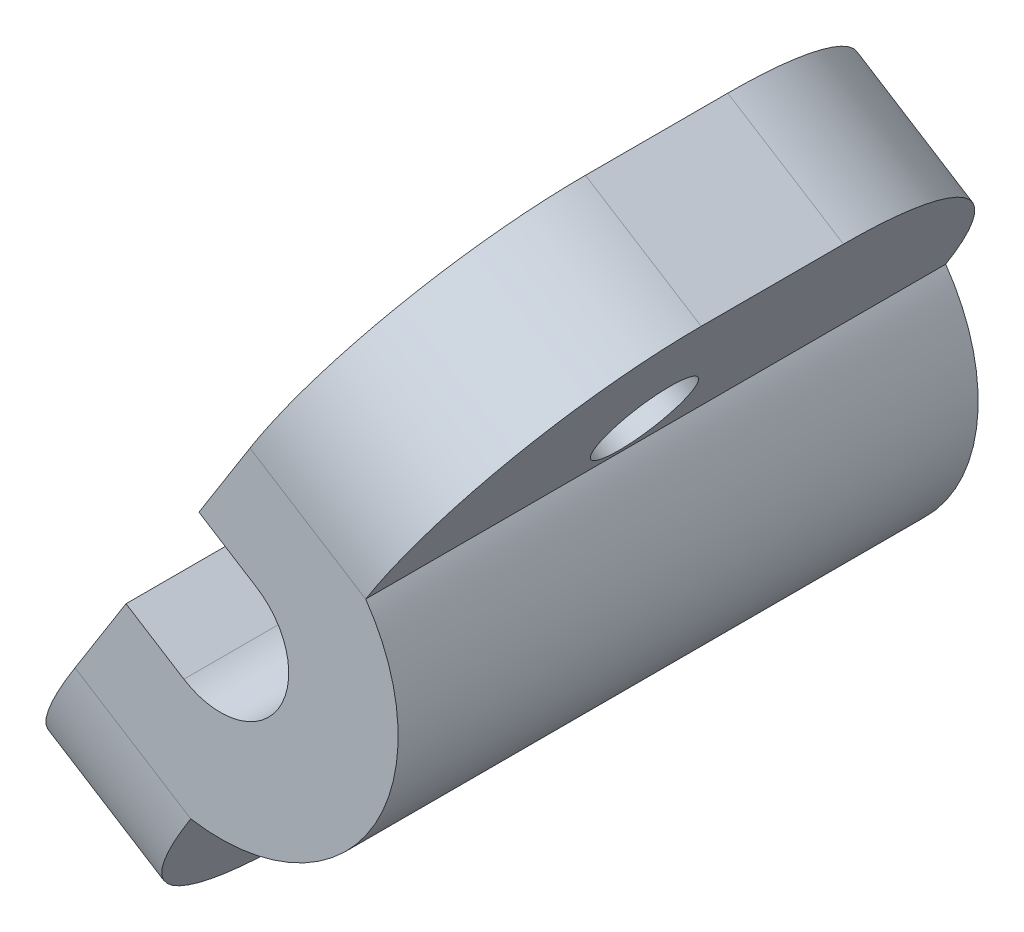
ISO-10303-21;
HEADER;
FILE_DESCRIPTION(('STEP AP214'),'2;1');
FILE_NAME('part.step','',(''),(''),'','','');
FILE_SCHEMA(('AUTOMOTIVE_DESIGN { 1 0 10303 214 1 1 1 1 }'));
ENDSEC;
DATA;
#1=APPLICATION_CONTEXT('core data for automotive mechanical design processes');
#2=APPLICATION_PROTOCOL_DEFINITION('international standard','automotive_design',2000,#1);
#3=PRODUCT_CONTEXT('',#1,'mechanical');
#4=PRODUCT('Part','Part','',(#3));
#5=PRODUCT_RELATED_PRODUCT_CATEGORY('part','',(#4));
#6=PRODUCT_DEFINITION_FORMATION('','',#4);
#7=PRODUCT_DEFINITION_CONTEXT('part definition',#1,'design');
#8=PRODUCT_DEFINITION('design','',#6,#7);
#9=PRODUCT_DEFINITION_SHAPE('','',#8);
#10=(LENGTH_UNIT() NAMED_UNIT(*) SI_UNIT(.MILLI.,.METRE.));
#11=(NAMED_UNIT(*) PLANE_ANGLE_UNIT() SI_UNIT($,.RADIAN.));
#12=(NAMED_UNIT(*) SI_UNIT($,.STERADIAN.) SOLID_ANGLE_UNIT());
#13=UNCERTAINTY_MEASURE_WITH_UNIT(LENGTH_MEASURE(1.E-05),#10,'distance_accuracy_value','');
#14=(GEOMETRIC_REPRESENTATION_CONTEXT(3) GLOBAL_UNCERTAINTY_ASSIGNED_CONTEXT((#13)) GLOBAL_UNIT_ASSIGNED_CONTEXT((#10,
#11,#12)) REPRESENTATION_CONTEXT('',''));
#15=CARTESIAN_POINT('',(0.,0.,0.));
#16=DIRECTION('',(0.,0.,1.));
#17=DIRECTION('',(1.,0.,0.));
#18=AXIS2_PLACEMENT_3D('',#15,#16,#17);
#19=CARTESIAN_POINT('',(0.,0.,-10.));
#20=DIRECTION('',(0.,0.,1.));
#21=DIRECTION('',(1.,0.,0.));
#22=AXIS2_PLACEMENT_3D('',#19,#20,#21);
#23=CYLINDRICAL_SURFACE('',#22,6.5);
#24=DIRECTION('',(0.,0.,1.));
#25=VECTOR('',#24,1.);
#26=CARTESIAN_POINT('',(5.31336454548809,3.74408295938407,-10.));
#27=LINE('',#26,#25);
#28=CARTESIAN_POINT('',(5.31336454548809,3.74408295938407,-13.2043019336396));
#29=VERTEX_POINT('',#28);
#30=CARTESIAN_POINT('',(5.31336454548809,3.74408295938407,8.));
#31=VERTEX_POINT('',#30);
#32=EDGE_CURVE('E138',#29,#31,#27,.T.);
#33=ORIENTED_EDGE('',*,*,#32,.T.);
#34=CARTESIAN_POINT('',(0.,0.,8.));
#35=DIRECTION('',(0.,0.,1.));
#36=DIRECTION('',(1.,0.,0.));
#37=AXIS2_PLACEMENT_3D('',#34,#35,#36);
#38=CIRCLE('',#37,6.5);
#39=CARTESIAN_POINT('',(-1.08284275613607,-6.40916933506079,8.));
#40=VERTEX_POINT('',#39);
#41=EDGE_CURVE('E214',#40,#31,#38,.T.);
#42=ORIENTED_EDGE('',*,*,#41,.F.);
#43=DIRECTION('',(0.,0.,1.));
#44=VECTOR('',#43,1.);
#45=CARTESIAN_POINT('',(-1.08284275613607,-6.40916933506079,-10.));
#46=LINE('',#45,#44);
#47=CARTESIAN_POINT('',(-1.08284275613607,-6.40916933506079,-13.2043019336395));
#48=VERTEX_POINT('',#47);
#49=EDGE_CURVE('E149',#48,#40,#46,.T.);
#50=ORIENTED_EDGE('',*,*,#49,.F.);
#51=CARTESIAN_POINT('',(0.,0.,-13.2043019336395));
#52=DIRECTION('',(0.,0.,1.));
#53=DIRECTION('',(0.,-1.,0.));
#54=AXIS2_PLACEMENT_3D('',#51,#52,#53);
#55=CIRCLE('',#54,6.5);
#56=EDGE_CURVE('E129',#48,#29,#55,.T.);
#57=ORIENTED_EDGE('',*,*,#56,.T.);
#58=EDGE_LOOP('',(#33,#42,#50,#57));
#59=FACE_BOUND('',#58,.T.);
#60=ADVANCED_FACE('F36',(#59),#23,.T.);
#61=CARTESIAN_POINT('',(2.11526089467601,-1.33254318783836,-10.));
#62=DIRECTION('',(-0.846104357870405,0.533017275135347,0.));
#63=DIRECTION('',(-0.533017275135347,-0.846104357870405,0.));
#64=AXIS2_PLACEMENT_3D('',#61,#62,#63);
#65=PLANE('',#64);
#66=CARTESIAN_POINT('',(-2.14887730640671,-8.1013780508015,-1.12499871142424));
#67=DIRECTION('',(0.846104357870405,-0.533017275135347,0.));
#68=DIRECTION('',(0.533017275135347,0.846104357870405,0.));
#69=AXIS2_PLACEMENT_3D('',#66,#67,#68);
#70=CIRCLE('',#69,1.75);
#71=CARTESIAN_POINT('',(-1.21609707491985,-6.62069542452829,-1.12499871142424));
#72=VERTEX_POINT('',#71);
#73=EDGE_CURVE('E217',#72,#72,#70,.T.);
#74=ORIENTED_EDGE('',*,*,#73,.F.);
#75=EDGE_LOOP('',(#74));
#76=FACE_BOUND('',#75,.T.);
#77=DIRECTION('',(0.,0.,1.));
#78=VECTOR('',#77,1.);
#79=CARTESIAN_POINT('',(-5.34698095721884,-13.178004198024,-10.));
#80=LINE('',#79,#78);
#81=CARTESIAN_POINT('',(-5.34698095721884,-13.178004198024,-5.20430193363952));
#82=VERTEX_POINT('',#81);
#83=CARTESIAN_POINT('',(-5.34698095721884,-13.178004198024,0.));
#84=VERTEX_POINT('',#83);
#85=EDGE_CURVE('E197',#82,#84,#80,.T.);
#86=ORIENTED_EDGE('',*,*,#85,.F.);
#87=CARTESIAN_POINT('',(-1.08284275613607,-6.40916933506078,-5.20430193363952));
#88=DIRECTION('',(-0.846104357870405,0.533017275135347,0.));
#89=DIRECTION('',(-0.533017275135347,-0.846104357870405,0.));
#90=AXIS2_PLACEMENT_3D('',#87,#88,#89);
#91=CIRCLE('',#90,8.);
#92=EDGE_CURVE('E135',#82,#48,#91,.F.);
#93=ORIENTED_EDGE('',*,*,#92,.T.);
#94=ORIENTED_EDGE('',*,*,#49,.T.);
#95=CARTESIAN_POINT('',(-1.08284275613607,-6.40916933506078,0.));
#96=DIRECTION('',(-0.846104357870405,0.533017275135347,0.));
#97=DIRECTION('',(-0.533017275135347,-0.846104357870405,0.));
#98=AXIS2_PLACEMENT_3D('',#95,#96,#97);
#99=CIRCLE('',#98,8.);
#100=EDGE_CURVE('E175',#40,#84,#99,.F.);
#101=ORIENTED_EDGE('',*,*,#100,.T.);
#102=EDGE_LOOP('',(#86,#93,#94,#101));
#103=FACE_BOUND('',#102,.T.);
#104=ADVANCED_FACE('F269',(#76,#103),#65,.F.);
#105=CARTESIAN_POINT('',(-7.46224185189485,-11.8454610101857,-10.));
#106=DIRECTION('',(0.533017275135347,0.846104357870405,0.));
#107=DIRECTION('',(-0.846104357870405,0.533017275135347,0.));
#108=AXIS2_PLACEMENT_3D('',#105,#106,#107);
#109=PLANE('',#108);
#110=DIRECTION('',(0.,0.,1.));
#111=VECTOR('',#110,1.);
#112=CARTESIAN_POINT('',(-9.57750274657088,-10.5129178223473,-10.));
#113=LINE('',#112,#111);
#114=CARTESIAN_POINT('',(-9.57750274657088,-10.5129178223473,-5.20430193363952));
#115=VERTEX_POINT('',#114);
#116=CARTESIAN_POINT('',(-9.57750274657088,-10.5129178223473,0.));
#117=VERTEX_POINT('',#116);
#118=EDGE_CURVE('E194',#115,#117,#113,.T.);
#119=ORIENTED_EDGE('',*,*,#118,.F.);
#120=DIRECTION('',(0.846104357870405,-0.533017275135347,0.));
#121=VECTOR('',#120,1.);
#122=CARTESIAN_POINT('',(-7.46224185189485,-11.8454610101857,-5.20430193363952));
#123=LINE('',#122,#121);
#124=EDGE_CURVE('E177',#115,#82,#123,.T.);
#125=ORIENTED_EDGE('',*,*,#124,.T.);
#126=ORIENTED_EDGE('',*,*,#85,.T.);
#127=DIRECTION('',(0.846104357870405,-0.533017275135347,0.));
#128=VECTOR('',#127,1.);
#129=CARTESIAN_POINT('',(-9.57750274657088,-10.5129178223473,0.));
#130=LINE('',#129,#128);
#131=EDGE_CURVE('E180',#84,#117,#130,.F.);
#132=ORIENTED_EDGE('',*,*,#131,.T.);
#133=EDGE_LOOP('',(#119,#125,#126,#132));
#134=FACE_BOUND('',#133,.T.);
#135=ADVANCED_FACE('F274',(#134),#109,.F.);
#136=CARTESIAN_POINT('',(-2.11526089467602,1.33254318783838,-10.));
#137=DIRECTION('',(0.846104357870405,-0.533017275135347,0.));
#138=DIRECTION('',(0.533017275135347,0.846104357870405,0.));
#139=AXIS2_PLACEMENT_3D('',#136,#137,#138);
#140=PLANE('',#139);
#141=CARTESIAN_POINT('',(-6.37939909575871,-5.43629167512479,-1.12499871142424));
#142=DIRECTION('',(0.846104357870405,-0.533017275135347,0.));
#143=DIRECTION('',(0.533017275135347,0.846104357870405,0.));
#144=AXIS2_PLACEMENT_3D('',#141,#142,#143);
#145=CIRCLE('',#144,1.75);
#146=CARTESIAN_POINT('',(-5.44661886427185,-3.95560904885158,-1.12499871142424));
#147=VERTEX_POINT('',#146);
#148=EDGE_CURVE('E150',#147,#147,#145,.F.);
#149=ORIENTED_EDGE('',*,*,#148,.F.);
#150=EDGE_LOOP('',(#149));
#151=FACE_BOUND('',#150,.T.);
#152=DIRECTION('',(-0.533017275135347,-0.846104357870405,0.));
#153=VECTOR('',#152,1.);
#154=CARTESIAN_POINT('',(-9.57750274657083,-10.5129178223472,-13.2043019336395));
#155=LINE('',#154,#153);
#156=CARTESIAN_POINT('',(-3.44780408251439,-0.782717706837633,-13.2043019336395));
#157=VERTEX_POINT('',#156);
#158=CARTESIAN_POINT('',(-5.31336454548811,-3.74408295938406,-13.2043019336395));
#159=VERTEX_POINT('',#158);
#160=EDGE_CURVE('E151',#157,#159,#155,.T.);
#161=ORIENTED_EDGE('',*,*,#160,.T.);
#162=CARTESIAN_POINT('',(-5.3133645454881,-3.74408295938405,-5.20430193363952));
#163=DIRECTION('',(0.846104357870405,-0.533017275135347,0.));
#164=DIRECTION('',(0.533017275135347,0.846104357870405,0.));
#165=AXIS2_PLACEMENT_3D('',#162,#163,#164);
#166=CIRCLE('',#165,8.);
#167=EDGE_CURVE('E169',#159,#115,#166,.F.);
#168=ORIENTED_EDGE('',*,*,#167,.T.);
#169=ORIENTED_EDGE('',*,*,#118,.T.);
#170=CARTESIAN_POINT('',(-5.3133645454881,-3.74408295938405,0.));
#171=DIRECTION('',(0.846104357870405,-0.533017275135347,0.));
#172=DIRECTION('',(0.533017275135347,0.846104357870405,0.));
#173=AXIS2_PLACEMENT_3D('',#170,#171,#172);
#174=CIRCLE('',#173,8.);
#175=CARTESIAN_POINT('',(-5.3133645454881,-3.74408295938405,8.));
#176=VERTEX_POINT('',#175);
#177=EDGE_CURVE('E171',#117,#176,#174,.F.);
#178=ORIENTED_EDGE('',*,*,#177,.T.);
#179=DIRECTION('',(-0.533017275135347,-0.846104357870405,0.));
#180=VECTOR('',#179,1.);
#181=CARTESIAN_POINT('',(-3.44780408251439,-0.782717706837633,8.));
#182=LINE('',#181,#180);
#183=CARTESIAN_POINT('',(-3.44780408251439,-0.782717706837633,8.));
#184=VERTEX_POINT('',#183);
#185=EDGE_CURVE('E145',#184,#176,#182,.T.);
#186=ORIENTED_EDGE('',*,*,#185,.F.);
#187=DIRECTION('',(0.,0.,1.));
#188=VECTOR('',#187,1.);
#189=CARTESIAN_POINT('',(-3.44780408251439,-0.782717706837633,-10.));
#190=LINE('',#189,#188);
#191=EDGE_CURVE('E192',#157,#184,#190,.T.);
#192=ORIENTED_EDGE('',*,*,#191,.F.);
#193=EDGE_LOOP('',(#161,#168,#169,#178,#186,#192));
#194=FACE_BOUND('',#193,.T.);
#195=ADVANCED_FACE('F291',(#151,#194),#140,.F.);
#196=CARTESIAN_POINT('',(-1.33254318783837,-2.11526089467601,-10.));
#197=DIRECTION('',(-0.533017275135347,-0.846104357870405,0.));
#198=DIRECTION('',(0.846104357870405,-0.533017275135347,0.));
#199=AXIS2_PLACEMENT_3D('',#196,#197,#198);
#200=PLANE('',#199);
#201=ORIENTED_EDGE('',*,*,#191,.T.);
#202=DIRECTION('',(-0.846104357870405,0.533017275135347,0.));
#203=VECTOR('',#202,1.);
#204=CARTESIAN_POINT('',(-1.33254318783837,-2.11526089467601,8.));
#205=LINE('',#204,#203);
#206=CARTESIAN_POINT('',(-1.33254318783837,-2.11526089467601,8.));
#207=VERTEX_POINT('',#206);
#208=EDGE_CURVE('E203',#207,#184,#205,.T.);
#209=ORIENTED_EDGE('',*,*,#208,.F.);
#210=DIRECTION('',(0.,0.,1.));
#211=VECTOR('',#210,1.);
#212=CARTESIAN_POINT('',(-1.33254318783837,-2.11526089467601,-10.));
#213=LINE('',#212,#211);
#214=CARTESIAN_POINT('',(-1.33254318783837,-2.11526089467601,-13.2043019336395));
#215=VERTEX_POINT('',#214);
#216=EDGE_CURVE('E190',#215,#207,#213,.T.);
#217=ORIENTED_EDGE('',*,*,#216,.F.);
#218=DIRECTION('',(-0.846104357870405,0.533017275135347,0.));
#219=VECTOR('',#218,1.);
#220=CARTESIAN_POINT('',(-3.44780408251439,-0.782717706837635,-13.2043019336395));
#221=LINE('',#220,#219);
#222=EDGE_CURVE('E229',#215,#157,#221,.T.);
#223=ORIENTED_EDGE('',*,*,#222,.T.);
#224=EDGE_LOOP('',(#201,#209,#217,#223));
#225=FACE_BOUND('',#224,.T.);
#226=ADVANCED_FACE('F299',(#225),#200,.F.);
#227=CARTESIAN_POINT('',(0.,0.,-10.));
#228=DIRECTION('',(0.,0.,1.));
#229=DIRECTION('',(1.,0.,0.));
#230=AXIS2_PLACEMENT_3D('',#227,#228,#229);
#231=CYLINDRICAL_SURFACE('',#230,2.5);
#232=ORIENTED_EDGE('',*,*,#216,.T.);
#233=CARTESIAN_POINT('',(0.,0.,8.));
#234=DIRECTION('',(0.,0.,-1.));
#235=DIRECTION('',(1.,0.,0.));
#236=AXIS2_PLACEMENT_3D('',#233,#234,#235);
#237=CIRCLE('',#236,2.5);
#238=CARTESIAN_POINT('',(1.33254318783837,2.11526089467602,8.));
#239=VERTEX_POINT('',#238);
#240=EDGE_CURVE('E206',#239,#207,#237,.T.);
#241=ORIENTED_EDGE('',*,*,#240,.F.);
#242=DIRECTION('',(0.,0.,1.));
#243=VECTOR('',#242,1.);
#244=CARTESIAN_POINT('',(1.33254318783837,2.11526089467602,-10.));
#245=LINE('',#244,#243);
#246=CARTESIAN_POINT('',(1.33254318783837,2.11526089467602,-13.2043019336395));
#247=VERTEX_POINT('',#246);
#248=EDGE_CURVE('E188',#247,#239,#245,.T.);
#249=ORIENTED_EDGE('',*,*,#248,.F.);
#250=CARTESIAN_POINT('',(0.,0.,-13.2043019336395));
#251=DIRECTION('',(0.,0.,1.));
#252=DIRECTION('',(0.,-1.,0.));
#253=AXIS2_PLACEMENT_3D('',#250,#251,#252);
#254=CIRCLE('',#253,2.5);
#255=EDGE_CURVE('E232',#215,#247,#254,.T.);
#256=ORIENTED_EDGE('',*,*,#255,.F.);
#257=EDGE_LOOP('',(#232,#241,#249,#256));
#258=FACE_BOUND('',#257,.T.);
#259=ADVANCED_FACE('F250',(#258),#231,.F.);
#260=CARTESIAN_POINT('',(1.33254318783837,2.11526089467602,-10.));
#261=DIRECTION('',(-0.533017275135347,-0.846104357870405,0.));
#262=DIRECTION('',(0.846104357870405,-0.533017275135347,0.));
#263=AXIS2_PLACEMENT_3D('',#260,#261,#262);
#264=PLANE('',#263);
#265=ORIENTED_EDGE('',*,*,#248,.T.);
#266=DIRECTION('',(0.846104357870405,-0.533017275135347,0.));
#267=VECTOR('',#266,1.);
#268=CARTESIAN_POINT('',(-0.782717706837655,3.44780408251439,8.));
#269=LINE('',#268,#267);
#270=CARTESIAN_POINT('',(-0.782717706837655,3.44780408251439,8.));
#271=VERTEX_POINT('',#270);
#272=EDGE_CURVE('E209',#271,#239,#269,.T.);
#273=ORIENTED_EDGE('',*,*,#272,.F.);
#274=DIRECTION('',(0.,0.,1.));
#275=VECTOR('',#274,1.);
#276=CARTESIAN_POINT('',(-0.782717706837655,3.44780408251439,-10.));
#277=LINE('',#276,#275);
#278=CARTESIAN_POINT('',(-0.782717706837655,3.44780408251439,-13.2043019336395));
#279=VERTEX_POINT('',#278);
#280=EDGE_CURVE('E185',#279,#271,#277,.T.);
#281=ORIENTED_EDGE('',*,*,#280,.F.);
#282=DIRECTION('',(0.846104357870405,-0.533017275135347,0.));
#283=VECTOR('',#282,1.);
#284=CARTESIAN_POINT('',(1.33254318783837,2.11526089467602,-13.2043019336395));
#285=LINE('',#284,#283);
#286=EDGE_CURVE('E235',#279,#247,#285,.T.);
#287=ORIENTED_EDGE('',*,*,#286,.T.);
#288=EDGE_LOOP('',(#265,#273,#281,#287));
#289=FACE_BOUND('',#288,.T.);
#290=ADVANCED_FACE('F245',(#289),#264,.T.);
#291=CARTESIAN_POINT('',(-2.11526089467602,1.33254318783838,-10.));
#292=DIRECTION('',(0.846104357870405,-0.533017275135347,0.));
#293=DIRECTION('',(0.533017275135347,0.846104357870405,0.));
#294=AXIS2_PLACEMENT_3D('',#291,#292,#293);
#295=PLANE('',#294);
#296=CARTESIAN_POINT('',(2.14887730640684,8.1013780508017,-1.12499871142424));
#297=DIRECTION('',(0.846104357870405,-0.533017275135347,0.));
#298=DIRECTION('',(0.533017275135347,0.846104357870405,0.));
#299=AXIS2_PLACEMENT_3D('',#296,#297,#298);
#300=CIRCLE('',#299,1.75);
#301=CARTESIAN_POINT('',(3.0816575378937,9.5820606770749,-1.12499871142424));
#302=VERTEX_POINT('',#301);
#303=EDGE_CURVE('E216',#302,#302,#300,.F.);
#304=ORIENTED_EDGE('',*,*,#303,.F.);
#305=EDGE_LOOP('',(#304));
#306=FACE_BOUND('',#305,.T.);
#307=DIRECTION('',(-0.533017275135347,-0.846104357870405,0.));
#308=VECTOR('',#307,1.);
#309=CARTESIAN_POINT('',(5.34698095721883,13.178004198024,8.));
#310=LINE('',#309,#308);
#311=CARTESIAN_POINT('',(1.08284275613606,6.40916933506081,8.));
#312=VERTEX_POINT('',#311);
#313=EDGE_CURVE('E212',#312,#271,#310,.T.);
#314=ORIENTED_EDGE('',*,*,#313,.F.);
#315=CARTESIAN_POINT('',(1.08284275613606,6.40916933506081,0.));
#316=DIRECTION('',(0.846104357870405,-0.533017275135347,0.));
#317=DIRECTION('',(0.533017275135347,0.846104357870405,0.));
#318=AXIS2_PLACEMENT_3D('',#315,#316,#317);
#319=CIRCLE('',#318,8.);
#320=CARTESIAN_POINT('',(5.34698095721883,13.178004198024,0.));
#321=VERTEX_POINT('',#320);
#322=EDGE_CURVE('E159',#312,#321,#319,.F.);
#323=ORIENTED_EDGE('',*,*,#322,.T.);
#324=DIRECTION('',(0.,0.,1.));
#325=VECTOR('',#324,1.);
#326=CARTESIAN_POINT('',(5.34698095721883,13.178004198024,-10.));
#327=LINE('',#326,#325);
#328=CARTESIAN_POINT('',(5.34698095721883,13.178004198024,-5.20430193363955));
#329=VERTEX_POINT('',#328);
#330=EDGE_CURVE('E183',#329,#321,#327,.T.);
#331=ORIENTED_EDGE('',*,*,#330,.F.);
#332=CARTESIAN_POINT('',(1.08284275613606,6.40916933506081,-5.20430193363955));
#333=DIRECTION('',(0.846104357870405,-0.533017275135347,0.));
#334=DIRECTION('',(0.533017275135347,0.846104357870405,0.));
#335=AXIS2_PLACEMENT_3D('',#332,#333,#334);
#336=CIRCLE('',#335,8.);
#337=CARTESIAN_POINT('',(1.08284275613605,6.40916933506079,-13.2043019336396));
#338=VERTEX_POINT('',#337);
#339=EDGE_CURVE('E161',#329,#338,#336,.F.);
#340=ORIENTED_EDGE('',*,*,#339,.T.);
#341=DIRECTION('',(-0.533017275135347,-0.846104357870405,0.));
#342=VECTOR('',#341,1.);
#343=CARTESIAN_POINT('',(-0.782717706837612,3.44780408251446,-13.2043019336395));
#344=LINE('',#343,#342);
#345=EDGE_CURVE('E132',#338,#279,#344,.T.);
#346=ORIENTED_EDGE('',*,*,#345,.T.);
#347=ORIENTED_EDGE('',*,*,#280,.T.);
#348=EDGE_LOOP('',(#314,#323,#331,#340,#346,#347));
#349=FACE_BOUND('',#348,.T.);
#350=ADVANCED_FACE('F241',(#306,#349),#295,.F.);
#351=CARTESIAN_POINT('',(7.46224185189486,11.8454610101857,-10.));
#352=DIRECTION('',(0.533017275135347,0.846104357870405,0.));
#353=DIRECTION('',(-0.846104357870405,0.533017275135347,0.));
#354=AXIS2_PLACEMENT_3D('',#351,#352,#353);
#355=PLANE('',#354);
#356=ORIENTED_EDGE('',*,*,#330,.T.);
#357=DIRECTION('',(-0.846104357870405,0.533017275135347,0.));
#358=VECTOR('',#357,1.);
#359=CARTESIAN_POINT('',(7.46224185189486,11.8454610101857,0.));
#360=LINE('',#359,#358);
#361=CARTESIAN_POINT('',(9.57750274657087,10.5129178223473,0.));
#362=VERTEX_POINT('',#361);
#363=EDGE_CURVE('E51',#321,#362,#360,.F.);
#364=ORIENTED_EDGE('',*,*,#363,.T.);
#365=DIRECTION('',(0.,0.,1.));
#366=VECTOR('',#365,1.);
#367=CARTESIAN_POINT('',(9.57750274657087,10.5129178223473,-10.));
#368=LINE('',#367,#366);
#369=CARTESIAN_POINT('',(9.57750274657087,10.5129178223473,-5.20430193363955));
#370=VERTEX_POINT('',#369);
#371=EDGE_CURVE('E144',#370,#362,#368,.T.);
#372=ORIENTED_EDGE('',*,*,#371,.F.);
#373=DIRECTION('',(-0.846104357870405,0.533017275135347,0.));
#374=VECTOR('',#373,1.);
#375=CARTESIAN_POINT('',(5.34698095721884,13.178004198024,-5.20430193363955));
#376=LINE('',#375,#374);
#377=EDGE_CURVE('E155',#370,#329,#376,.T.);
#378=ORIENTED_EDGE('',*,*,#377,.T.);
#379=EDGE_LOOP('',(#356,#364,#372,#378));
#380=FACE_BOUND('',#379,.T.);
#381=ADVANCED_FACE('F257',(#380),#355,.T.);
#382=CARTESIAN_POINT('',(2.11526089467601,-1.33254318783836,-10.));
#383=DIRECTION('',(-0.846104357870405,0.533017275135347,0.));
#384=DIRECTION('',(-0.533017275135347,-0.846104357870405,0.));
#385=AXIS2_PLACEMENT_3D('',#382,#383,#384);
#386=PLANE('',#385);
#387=CARTESIAN_POINT('',(6.37939909575885,5.43629167512498,-1.12499871142424));
#388=DIRECTION('',(0.846104357870405,-0.533017275135347,0.));
#389=DIRECTION('',(0.533017275135347,0.846104357870405,0.));
#390=AXIS2_PLACEMENT_3D('',#387,#388,#389);
#391=CIRCLE('',#390,1.75);
#392=CARTESIAN_POINT('',(7.3121793272457,6.91697430139819,-1.12499871142424));
#393=VERTEX_POINT('',#392);
#394=EDGE_CURVE('E220',#393,#393,#391,.T.);
#395=ORIENTED_EDGE('',*,*,#394,.F.);
#396=EDGE_LOOP('',(#395));
#397=FACE_BOUND('',#396,.T.);
#398=ORIENTED_EDGE('',*,*,#371,.T.);
#399=CARTESIAN_POINT('',(5.31336454548809,3.74408295938407,0.));
#400=DIRECTION('',(-0.846104357870405,0.533017275135347,0.));
#401=DIRECTION('',(-0.533017275135347,-0.846104357870405,0.));
#402=AXIS2_PLACEMENT_3D('',#399,#400,#401);
#403=CIRCLE('',#402,8.);
#404=EDGE_CURVE('E11',#362,#31,#403,.F.);
#405=ORIENTED_EDGE('',*,*,#404,.T.);
#406=ORIENTED_EDGE('',*,*,#32,.F.);
#407=CARTESIAN_POINT('',(5.31336454548809,3.74408295938407,-5.20430193363955));
#408=DIRECTION('',(-0.846104357870405,0.533017275135347,0.));
#409=DIRECTION('',(-0.533017275135347,-0.846104357870405,0.));
#410=AXIS2_PLACEMENT_3D('',#407,#408,#409);
#411=CIRCLE('',#410,8.);
#412=EDGE_CURVE('E44',#29,#370,#411,.F.);
#413=ORIENTED_EDGE('',*,*,#412,.T.);
#414=EDGE_LOOP('',(#398,#405,#406,#413));
#415=FACE_BOUND('',#414,.T.);
#416=ADVANCED_FACE('F139',(#397,#415),#386,.F.);
#417=CARTESIAN_POINT('',(0.,0.,8.));
#418=DIRECTION('',(0.,0.,1.));
#419=DIRECTION('',(1.,0.,0.));
#420=AXIS2_PLACEMENT_3D('',#417,#418,#419);
#421=PLANE('',#420);
#422=ORIENTED_EDGE('',*,*,#185,.T.);
#423=DIRECTION('',(0.846104357870405,-0.533017275135347,0.));
#424=VECTOR('',#423,1.);
#425=CARTESIAN_POINT('',(-1.08284275613607,-6.40916933506078,8.));
#426=LINE('',#425,#424);
#427=EDGE_CURVE('E163',#176,#40,#426,.T.);
#428=ORIENTED_EDGE('',*,*,#427,.T.);
#429=ORIENTED_EDGE('',*,*,#41,.T.);
#430=DIRECTION('',(-0.846104357870405,0.533017275135347,0.));
#431=VECTOR('',#430,1.);
#432=CARTESIAN_POINT('',(3.19810365081208,5.07662614722243,8.));
#433=LINE('',#432,#431);
#434=EDGE_CURVE('E166',#31,#312,#433,.T.);
#435=ORIENTED_EDGE('',*,*,#434,.T.);
#436=ORIENTED_EDGE('',*,*,#313,.T.);
#437=ORIENTED_EDGE('',*,*,#272,.T.);
#438=ORIENTED_EDGE('',*,*,#240,.T.);
#439=ORIENTED_EDGE('',*,*,#208,.T.);
#440=EDGE_LOOP('',(#422,#428,#429,#435,#436,#437,#438,#439));
#441=FACE_BOUND('',#440,.T.);
#442=ADVANCED_FACE('F253',(#441),#421,.T.);
#443=CARTESIAN_POINT('',(-2.03912559688473,10.7396789589662,-1.12499871142424));
#444=DIRECTION('',(0.846104357870405,-0.533017275135347,0.));
#445=DIRECTION('',(0.533017275135347,0.846104357870405,0.));
#446=AXIS2_PLACEMENT_3D('',#443,#444,#445);
#447=CYLINDRICAL_SURFACE('',#446,1.75);
#448=ORIENTED_EDGE('',*,*,#303,.T.);
#449=EDGE_LOOP('',(#448));
#450=FACE_BOUND('',#449,.T.);
#451=ORIENTED_EDGE('',*,*,#394,.T.);
#452=EDGE_LOOP('',(#451));
#453=FACE_BOUND('',#452,.T.);
#454=ADVANCED_FACE('F323',(#450,#453),#447,.F.);
#455=CARTESIAN_POINT('',(-10.5674019990503,-2.79799076696033,-1.12499871142424));
#456=DIRECTION('',(0.846104357870405,-0.533017275135347,0.));
#457=DIRECTION('',(0.533017275135347,0.846104357870405,0.));
#458=AXIS2_PLACEMENT_3D('',#455,#456,#457);
#459=CYLINDRICAL_SURFACE('',#458,1.75);
#460=ORIENTED_EDGE('',*,*,#148,.T.);
#461=EDGE_LOOP('',(#460));
#462=FACE_BOUND('',#461,.T.);
#463=ORIENTED_EDGE('',*,*,#73,.T.);
#464=EDGE_LOOP('',(#463));
#465=FACE_BOUND('',#464,.T.);
#466=ADVANCED_FACE('F285',(#462,#465),#459,.F.);
#467=CARTESIAN_POINT('',(-1.01958781774252E-13,-1.52698500193841E-13,-13.2043019336395));
#468=DIRECTION('',(0.,0.,1.));
#469=DIRECTION('',(0.533017275135347,0.846104357870405,0.));
#470=AXIS2_PLACEMENT_3D('',#467,#468,#469);
#471=PLANE('',#470);
#472=ORIENTED_EDGE('',*,*,#56,.F.);
#473=DIRECTION('',(0.846104357870405,-0.533017275135347,0.));
#474=VECTOR('',#473,1.);
#475=CARTESIAN_POINT('',(-3.19810365081209,-5.07662614722244,-13.2043019336395));
#476=LINE('',#475,#474);
#477=EDGE_CURVE('E134',#48,#159,#476,.F.);
#478=ORIENTED_EDGE('',*,*,#477,.T.);
#479=ORIENTED_EDGE('',*,*,#160,.F.);
#480=ORIENTED_EDGE('',*,*,#222,.F.);
#481=ORIENTED_EDGE('',*,*,#255,.T.);
#482=ORIENTED_EDGE('',*,*,#286,.F.);
#483=ORIENTED_EDGE('',*,*,#345,.F.);
#484=DIRECTION('',(-0.846104357870405,0.533017275135347,0.));
#485=VECTOR('',#484,1.);
#486=CARTESIAN_POINT('',(5.31336454548808,3.74408295938405,-13.2043019336395));
#487=LINE('',#486,#485);
#488=EDGE_CURVE('E126',#338,#29,#487,.F.);
#489=ORIENTED_EDGE('',*,*,#488,.T.);
#490=EDGE_LOOP('',(#472,#478,#479,#480,#481,#482,#483,#489));
#491=FACE_BOUND('',#490,.T.);
#492=ADVANCED_FACE('F127',(#491),#471,.F.);
#493=CARTESIAN_POINT('',(-3.19810365081208,-5.07662614722242,-5.20430193363952));
#494=DIRECTION('',(0.846104357870405,-0.533017275135347,0.));
#495=DIRECTION('',(0.533017275135347,0.846104357870405,0.));
#496=AXIS2_PLACEMENT_3D('',#493,#494,#495);
#497=CYLINDRICAL_SURFACE('',#496,8.);
#498=ORIENTED_EDGE('',*,*,#167,.F.);
#499=ORIENTED_EDGE('',*,*,#477,.F.);
#500=ORIENTED_EDGE('',*,*,#92,.F.);
#501=ORIENTED_EDGE('',*,*,#124,.F.);
#502=EDGE_LOOP('',(#498,#499,#500,#501));
#503=FACE_BOUND('',#502,.T.);
#504=ADVANCED_FACE('F265',(#503),#497,.T.);
#505=CARTESIAN_POINT('',(-3.19810365081208,-5.07662614722242,0.));
#506=DIRECTION('',(-0.846104357870405,0.533017275135347,0.));
#507=DIRECTION('',(-0.533017275135347,-0.846104357870405,0.));
#508=AXIS2_PLACEMENT_3D('',#505,#506,#507);
#509=CYLINDRICAL_SURFACE('',#508,8.);
#510=ORIENTED_EDGE('',*,*,#177,.F.);
#511=ORIENTED_EDGE('',*,*,#131,.F.);
#512=ORIENTED_EDGE('',*,*,#100,.F.);
#513=ORIENTED_EDGE('',*,*,#427,.F.);
#514=EDGE_LOOP('',(#510,#511,#512,#513));
#515=FACE_BOUND('',#514,.T.);
#516=ADVANCED_FACE('F260',(#515),#509,.T.);
#517=CARTESIAN_POINT('',(3.19810365081208,5.07662614722244,0.));
#518=DIRECTION('',(-0.846104357870405,0.533017275135347,0.));
#519=DIRECTION('',(-0.533017275135347,-0.846104357870405,0.));
#520=AXIS2_PLACEMENT_3D('',#517,#518,#519);
#521=CYLINDRICAL_SURFACE('',#520,8.);
#522=ORIENTED_EDGE('',*,*,#404,.F.);
#523=ORIENTED_EDGE('',*,*,#363,.F.);
#524=ORIENTED_EDGE('',*,*,#322,.F.);
#525=ORIENTED_EDGE('',*,*,#434,.F.);
#526=EDGE_LOOP('',(#522,#523,#524,#525));
#527=FACE_BOUND('',#526,.T.);
#528=ADVANCED_FACE('F258',(#527),#521,.T.);
#529=CARTESIAN_POINT('',(3.19810365081209,5.07662614722243,-5.20430193363955));
#530=DIRECTION('',(0.846104357870405,-0.533017275135347,0.));
#531=DIRECTION('',(0.533017275135347,0.846104357870405,0.));
#532=AXIS2_PLACEMENT_3D('',#529,#530,#531);
#533=CYLINDRICAL_SURFACE('',#532,8.);
#534=ORIENTED_EDGE('',*,*,#412,.F.);
#535=ORIENTED_EDGE('',*,*,#488,.F.);
#536=ORIENTED_EDGE('',*,*,#339,.F.);
#537=ORIENTED_EDGE('',*,*,#377,.F.);
#538=EDGE_LOOP('',(#534,#535,#536,#537));
#539=FACE_BOUND('',#538,.T.);
#540=ADVANCED_FACE('F38',(#539),#533,.T.);
#541=CLOSED_SHELL('',(#60,#104,#135,#195,#226,#259,#290,#350,#381,#416,#442,#454,#466,#492,#504,
#516,#528,#540));
#542=MANIFOLD_SOLID_BREP('B2',#541);
#543=ADVANCED_BREP_SHAPE_REPRESENTATION('',(#18,#542),#14);
#544=SHAPE_DEFINITION_REPRESENTATION(#9,#543);
ENDSEC;
END-ISO-10303-21;
